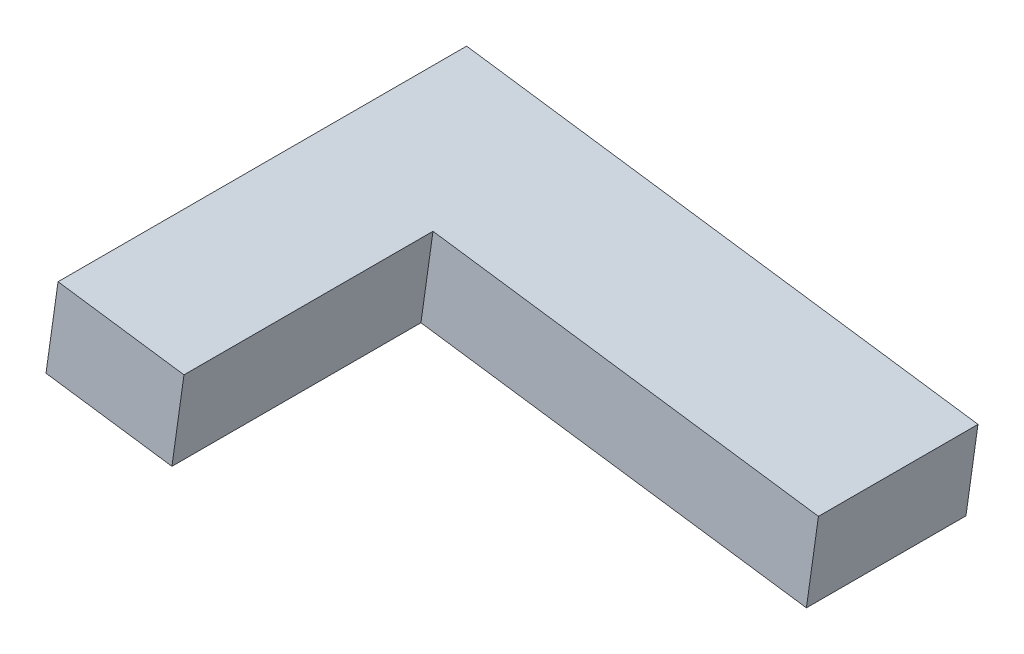
ISO-10303-21;
HEADER;
FILE_DESCRIPTION(('STEP AP214'),'2;1');
FILE_NAME('part.step','',(''),(''),'','','');
FILE_SCHEMA(('AUTOMOTIVE_DESIGN { 1 0 10303 214 1 1 1 1 }'));
ENDSEC;
DATA;
#1=APPLICATION_CONTEXT('core data for automotive mechanical design processes');
#2=APPLICATION_PROTOCOL_DEFINITION('international standard','automotive_design',2000,#1);
#3=PRODUCT_CONTEXT('',#1,'mechanical');
#4=PRODUCT('Part','Part','',(#3));
#5=PRODUCT_RELATED_PRODUCT_CATEGORY('part','',(#4));
#6=PRODUCT_DEFINITION_FORMATION('','',#4);
#7=PRODUCT_DEFINITION_CONTEXT('part definition',#1,'design');
#8=PRODUCT_DEFINITION('design','',#6,#7);
#9=PRODUCT_DEFINITION_SHAPE('','',#8);
#10=(LENGTH_UNIT() NAMED_UNIT(*) SI_UNIT(.MILLI.,.METRE.));
#11=(NAMED_UNIT(*) PLANE_ANGLE_UNIT() SI_UNIT($,.RADIAN.));
#12=(NAMED_UNIT(*) SI_UNIT($,.STERADIAN.) SOLID_ANGLE_UNIT());
#13=UNCERTAINTY_MEASURE_WITH_UNIT(LENGTH_MEASURE(1.E-05),#10,'distance_accuracy_value','');
#14=(GEOMETRIC_REPRESENTATION_CONTEXT(3) GLOBAL_UNCERTAINTY_ASSIGNED_CONTEXT((#13)) GLOBAL_UNIT_ASSIGNED_CONTEXT((#10,
#11,#12)) REPRESENTATION_CONTEXT('',''));
#15=CARTESIAN_POINT('',(0.,0.,0.));
#16=DIRECTION('',(0.,0.,1.));
#17=DIRECTION('',(1.,0.,0.));
#18=AXIS2_PLACEMENT_3D('',#15,#16,#17);
#19=CARTESIAN_POINT('',(740.113262853895,631.695860361933,1666.74690961428));
#20=DIRECTION('',(0.990268068741567,-0.139173100960088,0.));
#21=DIRECTION('',(-0.000106014336870208,-0.000754331202661768,-0.999999709872657));
#22=AXIS2_PLACEMENT_3D('',#19,#20,#21);
#23=PLANE('',#22);
#24=CARTESIAN_POINT('',(738.721532248074,621.793182547556,1666.75452705875));
#25=CARTESIAN_POINT('',(738.722515013993,621.800175290424,1676.02464715232));
#26=CARTESIAN_POINT('',(738.723497779913,621.807168033291,1685.29476724589));
#27=B_SPLINE_CURVE_WITH_KNOTS('',2,(#24,#25,#26),.UNSPECIFIED.,.F.,.F.,(3,3),(0.,1.),.UNSPECIFIED.);
#28=CARTESIAN_POINT('',(738.721532248074,621.793182547556,1666.75452705875));
#29=VERTEX_POINT('',#28);
#30=CARTESIAN_POINT('',(738.723497779913,621.807168033291,1685.29476724589));
#31=VERTEX_POINT('',#30);
#32=EDGE_CURVE('E110',#29,#31,#27,.T.);
#33=ORIENTED_EDGE('',*,*,#32,.F.);
#34=DIRECTION('',(-0.139173060582166,-0.990267781437723,0.000761744447259827));
#35=VECTOR('',#34,1.);
#36=CARTESIAN_POINT('',(740.113262853895,631.695860361933,1666.74690961428));
#37=LINE('',#36,#35);
#38=CARTESIAN_POINT('',(740.113262853895,631.695860361933,1666.74690961428));
#39=VERTEX_POINT('',#38);
#40=EDGE_CURVE('E33',#39,#29,#37,.T.);
#41=ORIENTED_EDGE('',*,*,#40,.F.);
#42=CARTESIAN_POINT('',(740.113262853895,631.695860361933,1666.74690961428));
#43=CARTESIAN_POINT('',(740.114245619815,631.702853104801,1676.01702970785));
#44=CARTESIAN_POINT('',(740.115228385734,631.709845847669,1685.28714980141));
#45=B_SPLINE_CURVE_WITH_KNOTS('',2,(#42,#43,#44),.UNSPECIFIED.,.F.,.F.,(3,3),(0.,1.),.UNSPECIFIED.);
#46=CARTESIAN_POINT('',(740.115228385734,631.709845847669,1685.28714980141));
#47=VERTEX_POINT('',#46);
#48=EDGE_CURVE('E154',#39,#47,#45,.T.);
#49=ORIENTED_EDGE('',*,*,#48,.T.);
#50=DIRECTION('',(-0.139173060582166,-0.990267781437723,0.000761744447259827));
#51=VECTOR('',#50,1.);
#52=CARTESIAN_POINT('',(740.115228385734,631.709845847669,1685.28714980141));
#53=LINE('',#52,#51);
#54=EDGE_CURVE('E11',#47,#31,#53,.T.);
#55=ORIENTED_EDGE('',*,*,#54,.T.);
#56=EDGE_LOOP('',(#33,#41,#49,#55));
#57=FACE_BOUND('',#56,.T.);
#58=ADVANCED_FACE('F17',(#57),#23,.T.);
#59=CARTESIAN_POINT('',(740.115228385734,631.709845847669,1685.28714980141));
#60=DIRECTION('',(0.000106014336864278,0.000754331202662602,0.999999709872657));
#61=DIRECTION('',(0.990268068741567,-0.139173100960088,0.));
#62=AXIS2_PLACEMENT_3D('',#59,#60,#61);
#63=PLANE('',#62);
#64=CARTESIAN_POINT('',(738.723497779913,621.807168033291,1685.29476724589));
#65=CARTESIAN_POINT('',(716.331010413758,624.954226898794,1685.29476724589));
#66=CARTESIAN_POINT('',(693.938523047603,628.101285764297,1685.29476724589));
#67=B_SPLINE_CURVE_WITH_KNOTS('',2,(#64,#65,#66),.UNSPECIFIED.,.F.,.F.,(3,3),(1.,2.),.UNSPECIFIED.);
#68=CARTESIAN_POINT('',(693.938523047603,628.101285764297,1685.29476724589));
#69=VERTEX_POINT('',#68);
#70=EDGE_CURVE('E118',#31,#69,#67,.T.);
#71=ORIENTED_EDGE('',*,*,#70,.F.);
#72=ORIENTED_EDGE('',*,*,#54,.F.);
#73=CARTESIAN_POINT('',(740.115228385734,631.709845847669,1685.28714980141));
#74=CARTESIAN_POINT('',(717.722741019579,634.856904713171,1685.28714980141));
#75=CARTESIAN_POINT('',(695.330253653425,638.003963578674,1685.28714980141));
#76=B_SPLINE_CURVE_WITH_KNOTS('',2,(#73,#74,#75),.UNSPECIFIED.,.F.,.F.,(3,3),(1.,2.),.UNSPECIFIED.);
#77=CARTESIAN_POINT('',(695.330253653425,638.003963578674,1685.28714980141));
#78=VERTEX_POINT('',#77);
#79=EDGE_CURVE('E162',#47,#78,#76,.T.);
#80=ORIENTED_EDGE('',*,*,#79,.T.);
#81=DIRECTION('',(-0.139173060582166,-0.990267781437723,0.000761744447259827));
#82=VECTOR('',#81,1.);
#83=CARTESIAN_POINT('',(695.330253653425,638.003963578674,1685.28714980141));
#84=LINE('',#83,#82);
#85=EDGE_CURVE('E25',#78,#69,#84,.T.);
#86=ORIENTED_EDGE('',*,*,#85,.T.);
#87=EDGE_LOOP('',(#71,#72,#80,#86));
#88=FACE_BOUND('',#87,.T.);
#89=ADVANCED_FACE('F161',(#88),#63,.T.);
#90=CARTESIAN_POINT('',(695.330253653425,638.003963578674,1685.28714980141));
#91=DIRECTION('',(0.990268068741567,-0.139173100960088,0.));
#92=DIRECTION('',(-0.000106014336868077,-0.000754331202662068,-0.999999709872657));
#93=AXIS2_PLACEMENT_3D('',#90,#91,#92);
#94=PLANE('',#93);
#95=CARTESIAN_POINT('',(693.938523047603,628.101285764297,1685.29476724589));
#96=CARTESIAN_POINT('',(693.940056856665,628.112199382857,1699.76270302105));
#97=CARTESIAN_POINT('',(693.941590665727,628.123113001416,1714.23063879623));
#98=B_SPLINE_CURVE_WITH_KNOTS('',2,(#95,#96,#97),.UNSPECIFIED.,.F.,.F.,(3,3),(2.,3.),.UNSPECIFIED.);
#99=CARTESIAN_POINT('',(693.941590665727,628.123113001416,1714.23063879623));
#100=VERTEX_POINT('',#99);
#101=EDGE_CURVE('E126',#69,#100,#98,.T.);
#102=ORIENTED_EDGE('',*,*,#101,.F.);
#103=ORIENTED_EDGE('',*,*,#85,.F.);
#104=CARTESIAN_POINT('',(695.330253653425,638.003963578674,1685.28714980141));
#105=CARTESIAN_POINT('',(695.331787462487,638.014877197234,1699.75508557658));
#106=CARTESIAN_POINT('',(695.333321271549,638.025790815794,1714.22302135175));
#107=B_SPLINE_CURVE_WITH_KNOTS('',2,(#104,#105,#106),.UNSPECIFIED.,.F.,.F.,(3,3),(2.,3.),.UNSPECIFIED.);
#108=CARTESIAN_POINT('',(695.333321271549,638.025790815794,1714.22302135175));
#109=VERTEX_POINT('',#108);
#110=EDGE_CURVE('E92',#78,#109,#107,.T.);
#111=ORIENTED_EDGE('',*,*,#110,.T.);
#112=DIRECTION('',(-0.139173060582166,-0.990267781437723,0.000761744447259827));
#113=VECTOR('',#112,1.);
#114=CARTESIAN_POINT('',(695.333321271549,638.025790815794,1714.22302135175));
#115=LINE('',#114,#113);
#116=EDGE_CURVE('E84',#109,#100,#115,.T.);
#117=ORIENTED_EDGE('',*,*,#116,.T.);
#118=EDGE_LOOP('',(#102,#103,#111,#117));
#119=FACE_BOUND('',#118,.T.);
#120=ADVANCED_FACE('F164',(#119),#94,.T.);
#121=CARTESIAN_POINT('',(695.333321271549,638.025790815794,1714.22302135175));
#122=DIRECTION('',(0.000106014336864278,0.000754331202662602,0.999999709872657));
#123=DIRECTION('',(0.990268068741567,-0.139173100960088,0.));
#124=AXIS2_PLACEMENT_3D('',#121,#122,#123);
#125=PLANE('',#124);
#126=CARTESIAN_POINT('',(693.941590665727,628.123113001416,1714.23063879623));
#127=CARTESIAN_POINT('',(686.626035969635,629.151247164716,1714.23063879623));
#128=CARTESIAN_POINT('',(679.310481273543,630.179381328016,1714.23063879623));
#129=B_SPLINE_CURVE_WITH_KNOTS('',2,(#126,#127,#128),.UNSPECIFIED.,.F.,.F.,(3,3),(3.,4.),.UNSPECIFIED.);
#130=CARTESIAN_POINT('',(679.310481273543,630.179381328016,1714.23063879623));
#131=VERTEX_POINT('',#130);
#132=EDGE_CURVE('E134',#100,#131,#129,.T.);
#133=ORIENTED_EDGE('',*,*,#132,.F.);
#134=ORIENTED_EDGE('',*,*,#116,.F.);
#135=CARTESIAN_POINT('',(695.333321271549,638.025790815794,1714.22302135175));
#136=CARTESIAN_POINT('',(688.017766575456,639.053924979093,1714.22302135175));
#137=CARTESIAN_POINT('',(680.702211879364,640.082059142393,1714.22302135175));
#138=B_SPLINE_CURVE_WITH_KNOTS('',2,(#135,#136,#137),.UNSPECIFIED.,.F.,.F.,(3,3),(3.,4.),.UNSPECIFIED.);
#139=CARTESIAN_POINT('',(680.702211879364,640.082059142393,1714.22302135175));
#140=VERTEX_POINT('',#139);
#141=EDGE_CURVE('E87',#109,#140,#138,.T.);
#142=ORIENTED_EDGE('',*,*,#141,.T.);
#143=DIRECTION('',(-0.139173060582166,-0.990267781437723,0.000761744447259827));
#144=VECTOR('',#143,1.);
#145=CARTESIAN_POINT('',(680.702211879364,640.082059142393,1714.22302135175));
#146=LINE('',#145,#144);
#147=EDGE_CURVE('E73',#140,#131,#146,.T.);
#148=ORIENTED_EDGE('',*,*,#147,.T.);
#149=EDGE_LOOP('',(#133,#134,#142,#148));
#150=FACE_BOUND('',#149,.T.);
#151=ADVANCED_FACE('F88',(#150),#125,.T.);
#152=CARTESIAN_POINT('',(680.702211879364,640.082059142393,1714.22302135175));
#153=DIRECTION('',(-0.990268068741567,0.139173100960088,0.));
#154=DIRECTION('',(0.000106014336864278,0.000754331202662602,0.999999709872657));
#155=AXIS2_PLACEMENT_3D('',#152,#153,#154);
#156=PLANE('',#155);
#157=CARTESIAN_POINT('',(679.310481273543,630.179381328016,1714.23063879623));
#158=CARTESIAN_POINT('',(679.307964698561,630.161474966589,1690.49258292749));
#159=CARTESIAN_POINT('',(679.30544812358,630.143568605161,1666.75452705875));
#160=B_SPLINE_CURVE_WITH_KNOTS('',2,(#157,#158,#159),.UNSPECIFIED.,.F.,.F.,(3,3),(4.,5.),.UNSPECIFIED.);
#161=CARTESIAN_POINT('',(679.30544812358,630.143568605161,1666.75452705875));
#162=VERTEX_POINT('',#161);
#163=EDGE_CURVE('E80',#131,#162,#160,.T.);
#164=ORIENTED_EDGE('',*,*,#163,.F.);
#165=ORIENTED_EDGE('',*,*,#147,.F.);
#166=CARTESIAN_POINT('',(680.702211879364,640.082059142393,1714.22302135175));
#167=CARTESIAN_POINT('',(680.699695304383,640.064152780966,1690.48496548302));
#168=CARTESIAN_POINT('',(680.697178729401,640.046246419538,1666.74690961428));
#169=B_SPLINE_CURVE_WITH_KNOTS('',2,(#166,#167,#168),.UNSPECIFIED.,.F.,.F.,(3,3),(4.,5.),.UNSPECIFIED.);
#170=CARTESIAN_POINT('',(680.697178729401,640.046246419538,1666.74690961428));
#171=VERTEX_POINT('',#170);
#172=EDGE_CURVE('E77',#140,#171,#169,.T.);
#173=ORIENTED_EDGE('',*,*,#172,.T.);
#174=DIRECTION('',(-0.139173060582166,-0.990267781437723,0.000761744447259827));
#175=VECTOR('',#174,1.);
#176=CARTESIAN_POINT('',(680.697178729401,640.046246419538,1666.74690961428));
#177=LINE('',#176,#175);
#178=EDGE_CURVE('E55',#171,#162,#177,.T.);
#179=ORIENTED_EDGE('',*,*,#178,.T.);
#180=EDGE_LOOP('',(#164,#165,#173,#179));
#181=FACE_BOUND('',#180,.T.);
#182=ADVANCED_FACE('F75',(#181),#156,.T.);
#183=CARTESIAN_POINT('',(680.697178729401,640.046246419538,1666.74690961428));
#184=DIRECTION('',(-0.000106014336864278,-0.000754331202662602,-0.999999709872657));
#185=DIRECTION('',(-0.990268068741567,0.139173100960088,0.));
#186=AXIS2_PLACEMENT_3D('',#183,#184,#185);
#187=PLANE('',#186);
#188=CARTESIAN_POINT('',(679.30544812358,630.143568605161,1666.75452705875));
#189=CARTESIAN_POINT('',(709.013490185827,625.968375576358,1666.75452705875));
#190=CARTESIAN_POINT('',(738.721532248074,621.793182547556,1666.75452705875));
#191=B_SPLINE_CURVE_WITH_KNOTS('',2,(#188,#189,#190),.UNSPECIFIED.,.F.,.F.,(3,3),(5.,6.),.UNSPECIFIED.);
#192=EDGE_CURVE('E147',#162,#29,#191,.T.);
#193=ORIENTED_EDGE('',*,*,#192,.F.);
#194=ORIENTED_EDGE('',*,*,#178,.F.);
#195=CARTESIAN_POINT('',(680.697178729401,640.046246419538,1666.74690961428));
#196=CARTESIAN_POINT('',(710.405220791648,635.871053390736,1666.74690961428));
#197=CARTESIAN_POINT('',(740.113262853895,631.695860361933,1666.74690961428));
#198=B_SPLINE_CURVE_WITH_KNOTS('',2,(#195,#196,#197),.UNSPECIFIED.,.F.,.F.,(3,3),(5.,6.),.UNSPECIFIED.);
#199=EDGE_CURVE('E96',#171,#39,#198,.T.);
#200=ORIENTED_EDGE('',*,*,#199,.T.);
#201=ORIENTED_EDGE('',*,*,#40,.T.);
#202=EDGE_LOOP('',(#193,#194,#200,#201));
#203=FACE_BOUND('',#202,.T.);
#204=ADVANCED_FACE('F198',(#203),#187,.T.);
#205=CARTESIAN_POINT('',(740.114245619815,631.702853104801,1676.01702970785));
#206=DIRECTION('',(0.139173060582166,0.990267781437723,-0.000761744447247851));
#207=DIRECTION('',(0.000106014336862611,0.000754331202650742,0.999999709872657));
#208=AXIS2_PLACEMENT_3D('',#205,#206,#207);
#209=PLANE('',#208);
#210=ORIENTED_EDGE('',*,*,#48,.F.);
#211=ORIENTED_EDGE('',*,*,#199,.F.);
#212=ORIENTED_EDGE('',*,*,#172,.F.);
#213=ORIENTED_EDGE('',*,*,#141,.F.);
#214=ORIENTED_EDGE('',*,*,#110,.F.);
#215=ORIENTED_EDGE('',*,*,#79,.F.);
#216=EDGE_LOOP('',(#210,#211,#212,#213,#214,#215));
#217=FACE_BOUND('',#216,.T.);
#218=ADVANCED_FACE('F95',(#217),#209,.T.);
#219=CARTESIAN_POINT('',(738.722515013993,621.800175290424,1676.02464715232));
#220=DIRECTION('',(0.139173060582166,0.990267781437723,-0.000761744447247851));
#221=DIRECTION('',(0.000106014336862611,0.000754331202650742,0.999999709872657));
#222=AXIS2_PLACEMENT_3D('',#219,#220,#221);
#223=PLANE('',#222);
#224=ORIENTED_EDGE('',*,*,#32,.T.);
#225=ORIENTED_EDGE('',*,*,#70,.T.);
#226=ORIENTED_EDGE('',*,*,#101,.T.);
#227=ORIENTED_EDGE('',*,*,#132,.T.);
#228=ORIENTED_EDGE('',*,*,#163,.T.);
#229=ORIENTED_EDGE('',*,*,#192,.T.);
#230=EDGE_LOOP('',(#224,#225,#226,#227,#228,#229));
#231=FACE_BOUND('',#230,.T.);
#232=ADVANCED_FACE('F166',(#231),#223,.F.);
#233=CLOSED_SHELL('',(#58,#89,#120,#151,#182,#204,#218,#232));
#234=MANIFOLD_SOLID_BREP('B1',#233);
#235=ADVANCED_BREP_SHAPE_REPRESENTATION('',(#18,#234),#14);
#236=SHAPE_DEFINITION_REPRESENTATION(#9,#235);
ENDSEC;
END-ISO-10303-21;
